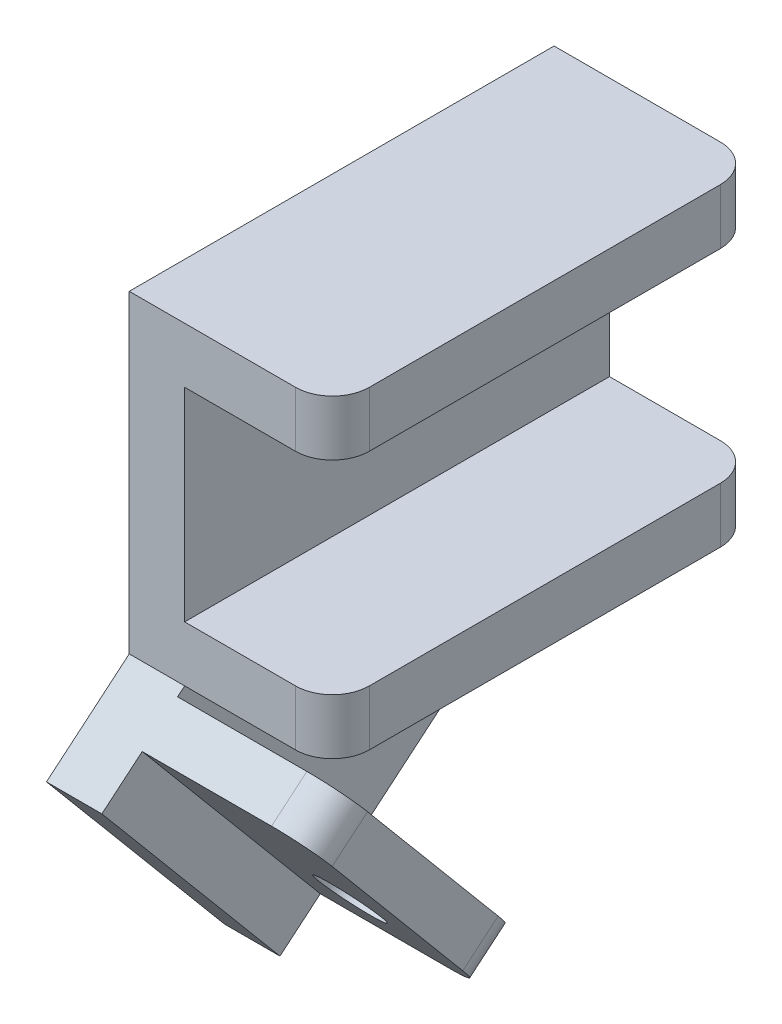
ISO-10303-21;
HEADER;
FILE_DESCRIPTION(('STEP AP214'),'2;1');
FILE_NAME('part.step','',(''),(''),'','','');
FILE_SCHEMA(('AUTOMOTIVE_DESIGN { 1 0 10303 214 1 1 1 1 }'));
ENDSEC;
DATA;
#1=APPLICATION_CONTEXT('core data for automotive mechanical design processes');
#2=APPLICATION_PROTOCOL_DEFINITION('international standard','automotive_design',2000,#1);
#3=PRODUCT_CONTEXT('',#1,'mechanical');
#4=PRODUCT('Part','Part','',(#3));
#5=PRODUCT_RELATED_PRODUCT_CATEGORY('part','',(#4));
#6=PRODUCT_DEFINITION_FORMATION('','',#4);
#7=PRODUCT_DEFINITION_CONTEXT('part definition',#1,'design');
#8=PRODUCT_DEFINITION('design','',#6,#7);
#9=PRODUCT_DEFINITION_SHAPE('','',#8);
#10=(LENGTH_UNIT() NAMED_UNIT(*) SI_UNIT(.MILLI.,.METRE.));
#11=(NAMED_UNIT(*) PLANE_ANGLE_UNIT() SI_UNIT($,.RADIAN.));
#12=(NAMED_UNIT(*) SI_UNIT($,.STERADIAN.) SOLID_ANGLE_UNIT());
#13=UNCERTAINTY_MEASURE_WITH_UNIT(LENGTH_MEASURE(1.E-05),#10,'distance_accuracy_value','');
#14=(GEOMETRIC_REPRESENTATION_CONTEXT(3) GLOBAL_UNCERTAINTY_ASSIGNED_CONTEXT((#13)) GLOBAL_UNIT_ASSIGNED_CONTEXT((#10,
#11,#12)) REPRESENTATION_CONTEXT('',''));
#15=CARTESIAN_POINT('',(0.,0.,0.));
#16=DIRECTION('',(0.,0.,1.));
#17=DIRECTION('',(1.,0.,0.));
#18=AXIS2_PLACEMENT_3D('',#15,#16,#17);
#19=CARTESIAN_POINT('',(-8.,-15.9283628290596,25.2981333293569));
#20=DIRECTION('',(0.,0.642787609686538,-0.76604444311898));
#21=DIRECTION('',(0.,0.76604444311898,0.642787609686538));
#22=AXIS2_PLACEMENT_3D('',#19,#20,#21);
#23=PLANE('',#22);
#24=CARTESIAN_POINT('',(-3.5,-23.9718294818089,18.5488634276483));
#25=DIRECTION('',(0.,0.642787609686538,-0.76604444311898));
#26=DIRECTION('',(0.,0.76604444311898,0.642787609686538));
#27=AXIS2_PLACEMENT_3D('',#24,#25,#26);
#28=CIRCLE('',#27,1.7);
#29=CARTESIAN_POINT('',(-3.5,-22.6695539285066,19.6416023641154));
#30=VERTEX_POINT('',#29);
#31=EDGE_CURVE('E226',#30,#30,#28,.T.);
#32=ORIENTED_EDGE('',*,*,#31,.T.);
#33=EDGE_LOOP('',(#32));
#34=FACE_BOUND('',#33,.T.);
#35=DIRECTION('',(0.,-0.766044443118979,-0.642787609686538));
#36=VECTOR('',#35,1.);
#37=CARTESIAN_POINT('',(0.999999999999999,-27.4190294758443,15.6563191840589));
#38=LINE('',#37,#36);
#39=CARTESIAN_POINT('',(0.999999999999999,-17.4604517152976,24.0125581099839));
#40=VERTEX_POINT('',#39);
#41=CARTESIAN_POINT('',(0.999999999999999,-25.8869405896063,16.9418944034319));
#42=VERTEX_POINT('',#41);
#43=EDGE_CURVE('E230',#40,#42,#38,.T.);
#44=ORIENTED_EDGE('',*,*,#43,.F.);
#45=CARTESIAN_POINT('',(-1.,-17.4604517152976,24.0125581099839));
#46=DIRECTION('',(0.,0.642787609686538,-0.76604444311898));
#47=DIRECTION('',(0.,0.76604444311898,0.642787609686538));
#48=AXIS2_PLACEMENT_3D('',#45,#46,#47);
#49=CIRCLE('',#48,2.);
#50=CARTESIAN_POINT('',(-1.,-15.9283628290596,25.2981333293569));
#51=VERTEX_POINT('',#50);
#52=EDGE_CURVE('E277',#40,#51,#49,.F.);
#53=ORIENTED_EDGE('',*,*,#52,.T.);
#54=DIRECTION('',(-1.,0.,0.));
#55=VECTOR('',#54,1.);
#56=CARTESIAN_POINT('',(-8.,-15.9283628290596,25.2981333293569));
#57=LINE('',#56,#55);
#58=CARTESIAN_POINT('',(-8.,-15.9283628290596,25.2981333293569));
#59=VERTEX_POINT('',#58);
#60=EDGE_CURVE('E398',#51,#59,#57,.T.);
#61=ORIENTED_EDGE('',*,*,#60,.T.);
#62=DIRECTION('',(0.,0.766044443118979,0.642787609686538));
#63=VECTOR('',#62,1.);
#64=CARTESIAN_POINT('',(-8.,-15.9283628290596,25.2981333293569));
#65=LINE('',#64,#63);
#66=CARTESIAN_POINT('',(-8.,-27.4190294758443,15.6563191840589));
#67=VERTEX_POINT('',#66);
#68=EDGE_CURVE('E209',#67,#59,#65,.T.);
#69=ORIENTED_EDGE('',*,*,#68,.F.);
#70=DIRECTION('',(-1.,0.,0.));
#71=VECTOR('',#70,1.);
#72=CARTESIAN_POINT('',(-8.,-27.4190294758443,15.6563191840589));
#73=LINE('',#72,#71);
#74=CARTESIAN_POINT('',(-1.,-27.4190294758443,15.6563191840589));
#75=VERTEX_POINT('',#74);
#76=EDGE_CURVE('E401',#75,#67,#73,.T.);
#77=ORIENTED_EDGE('',*,*,#76,.F.);
#78=CARTESIAN_POINT('',(-1.,-25.8869405896063,16.9418944034319));
#79=DIRECTION('',(0.,0.642787609686538,-0.76604444311898));
#80=DIRECTION('',(0.,0.76604444311898,0.642787609686538));
#81=AXIS2_PLACEMENT_3D('',#78,#79,#80);
#82=CIRCLE('',#81,2.);
#83=EDGE_CURVE('E275',#75,#42,#82,.F.);
#84=ORIENTED_EDGE('',*,*,#83,.T.);
#85=EDGE_LOOP('',(#44,#53,#61,#69,#77,#84));
#86=FACE_BOUND('',#85,.T.);
#87=ADVANCED_FACE('F33',(#34,#86),#23,.F.);
#88=CARTESIAN_POINT('',(-8.,0.,0.));
#89=DIRECTION('',(-1.,0.,0.));
#90=DIRECTION('',(0.,0.,1.));
#91=AXIS2_PLACEMENT_3D('',#88,#89,#90);
#92=PLANE('',#91);
#93=DIRECTION('',(0.,0.76604444311898,0.642787609686537));
#94=VECTOR('',#93,1.);
#95=CARTESIAN_POINT('',(-8.,-14.3213938048433,23.3830222215595));
#96=LINE('',#95,#94);
#97=CARTESIAN_POINT('',(-8.,-25.812060451628,13.7412080762614));
#98=VERTEX_POINT('',#97);
#99=CARTESIAN_POINT('',(-8.,-14.3213938048433,23.3830222215595));
#100=VERTEX_POINT('',#99);
#101=EDGE_CURVE('E229',#98,#100,#96,.T.);
#102=ORIENTED_EDGE('',*,*,#101,.F.);
#103=DIRECTION('',(0.,-0.642787609686538,0.766044443118979));
#104=VECTOR('',#103,1.);
#105=CARTESIAN_POINT('',(-8.,-14.1653774871443,-0.13876818846781));
#106=LINE('',#105,#104);
#107=CARTESIAN_POINT('',(-8.,-14.1653774871443,-0.13876818846781));
#108=VERTEX_POINT('',#107);
#109=EDGE_CURVE('E242',#108,#98,#106,.T.);
#110=ORIENTED_EDGE('',*,*,#109,.F.);
#111=DIRECTION('',(0.,-0.766044443118982,-0.642787609686535));
#112=VECTOR('',#111,1.);
#113=CARTESIAN_POINT('',(-8.,-14.,0.));
#114=LINE('',#113,#112);
#115=CARTESIAN_POINT('',(-8.,-14.,0.));
#116=VERTEX_POINT('',#115);
#117=EDGE_CURVE('E246',#116,#108,#114,.T.);
#118=ORIENTED_EDGE('',*,*,#117,.F.);
#119=DIRECTION('',(0.,0.,-1.));
#120=VECTOR('',#119,1.);
#121=CARTESIAN_POINT('',(-8.,-14.,23.));
#122=LINE('',#121,#120);
#123=CARTESIAN_POINT('',(-8.,-14.,23.));
#124=VERTEX_POINT('',#123);
#125=EDGE_CURVE('E250',#124,#116,#122,.T.);
#126=ORIENTED_EDGE('',*,*,#125,.F.);
#127=DIRECTION('',(0.,-0.642787609686537,0.76604444311898));
#128=VECTOR('',#127,1.);
#129=CARTESIAN_POINT('',(-8.,-14.,23.));
#130=LINE('',#129,#128);
#131=EDGE_CURVE('E245',#124,#100,#130,.T.);
#132=ORIENTED_EDGE('',*,*,#131,.T.);
#133=EDGE_LOOP('',(#102,#110,#118,#126,#132));
#134=FACE_BOUND('',#133,.T.);
#135=ADVANCED_FACE('F428',(#134),#92,.F.);
#136=CARTESIAN_POINT('',(0.,0.,23.));
#137=DIRECTION('',(-1.,0.,0.));
#138=DIRECTION('',(0.,0.,1.));
#139=AXIS2_PLACEMENT_3D('',#136,#137,#138);
#140=PLANE('',#139);
#141=DIRECTION('',(0.,0.,-1.));
#142=VECTOR('',#141,1.);
#143=CARTESIAN_POINT('',(0.,0.,23.));
#144=LINE('',#143,#142);
#145=CARTESIAN_POINT('',(0.,0.,21.));
#146=VERTEX_POINT('',#145);
#147=CARTESIAN_POINT('',(0.,0.,2.));
#148=VERTEX_POINT('',#147);
#149=EDGE_CURVE('E376',#146,#148,#144,.T.);
#150=ORIENTED_EDGE('',*,*,#149,.T.);
#151=DIRECTION('',(0.,1.,0.));
#152=VECTOR('',#151,1.);
#153=CARTESIAN_POINT('',(0.,0.,2.));
#154=LINE('',#153,#152);
#155=CARTESIAN_POINT('',(0.,3.,2.));
#156=VERTEX_POINT('',#155);
#157=EDGE_CURVE('E307',#148,#156,#154,.T.);
#158=ORIENTED_EDGE('',*,*,#157,.T.);
#159=DIRECTION('',(0.,0.,-1.));
#160=VECTOR('',#159,1.);
#161=CARTESIAN_POINT('',(0.,3.,23.));
#162=LINE('',#161,#160);
#163=CARTESIAN_POINT('',(0.,3.,21.));
#164=VERTEX_POINT('',#163);
#165=EDGE_CURVE('E272',#164,#156,#162,.T.);
#166=ORIENTED_EDGE('',*,*,#165,.F.);
#167=DIRECTION('',(0.,1.,0.));
#168=VECTOR('',#167,1.);
#169=CARTESIAN_POINT('',(0.,0.,21.));
#170=LINE('',#169,#168);
#171=EDGE_CURVE('E305',#164,#146,#170,.F.);
#172=ORIENTED_EDGE('',*,*,#171,.T.);
#173=EDGE_LOOP('',(#150,#158,#166,#172));
#174=FACE_BOUND('',#173,.T.);
#175=ADVANCED_FACE('F469',(#174),#140,.F.);
#176=CARTESIAN_POINT('',(0.,3.,23.));
#177=DIRECTION('',(0.,-1.,0.));
#178=DIRECTION('',(0.,0.,-1.));
#179=AXIS2_PLACEMENT_3D('',#176,#177,#178);
#180=PLANE('',#179);
#181=ORIENTED_EDGE('',*,*,#165,.T.);
#182=CARTESIAN_POINT('',(-2.,3.,2.));
#183=DIRECTION('',(0.,-1.,0.));
#184=DIRECTION('',(0.,0.,-1.));
#185=AXIS2_PLACEMENT_3D('',#182,#183,#184);
#186=CIRCLE('',#185,2.);
#187=CARTESIAN_POINT('',(-2.,3.,0.));
#188=VERTEX_POINT('',#187);
#189=EDGE_CURVE('E311',#156,#188,#186,.F.);
#190=ORIENTED_EDGE('',*,*,#189,.T.);
#191=DIRECTION('',(-1.,0.,0.));
#192=VECTOR('',#191,1.);
#193=CARTESIAN_POINT('',(0.,3.,0.));
#194=LINE('',#193,#192);
#195=CARTESIAN_POINT('',(-11.,3.,0.));
#196=VERTEX_POINT('',#195);
#197=EDGE_CURVE('E397',#188,#196,#194,.T.);
#198=ORIENTED_EDGE('',*,*,#197,.T.);
#199=DIRECTION('',(0.,0.,-1.));
#200=VECTOR('',#199,1.);
#201=CARTESIAN_POINT('',(-11.,3.,23.));
#202=LINE('',#201,#200);
#203=CARTESIAN_POINT('',(-11.,3.,23.));
#204=VERTEX_POINT('',#203);
#205=EDGE_CURVE('E348',#204,#196,#202,.T.);
#206=ORIENTED_EDGE('',*,*,#205,.F.);
#207=DIRECTION('',(-1.,0.,0.));
#208=VECTOR('',#207,1.);
#209=CARTESIAN_POINT('',(0.,3.,23.));
#210=LINE('',#209,#208);
#211=CARTESIAN_POINT('',(-2.,3.,23.));
#212=VERTEX_POINT('',#211);
#213=EDGE_CURVE('E375',#212,#204,#210,.T.);
#214=ORIENTED_EDGE('',*,*,#213,.F.);
#215=CARTESIAN_POINT('',(-2.,3.,21.));
#216=DIRECTION('',(0.,-1.,0.));
#217=DIRECTION('',(0.,0.,-1.));
#218=AXIS2_PLACEMENT_3D('',#215,#216,#217);
#219=CIRCLE('',#218,2.);
#220=EDGE_CURVE('E56',#212,#164,#219,.F.);
#221=ORIENTED_EDGE('',*,*,#220,.T.);
#222=EDGE_LOOP('',(#181,#190,#198,#206,#214,#221));
#223=FACE_BOUND('',#222,.T.);
#224=ADVANCED_FACE('F495',(#223),#180,.F.);
#225=CARTESIAN_POINT('',(-11.,3.,23.));
#226=DIRECTION('',(1.,0.,0.));
#227=DIRECTION('',(0.,0.,-1.));
#228=AXIS2_PLACEMENT_3D('',#225,#226,#227);
#229=PLANE('',#228);
#230=CARTESIAN_POINT('',(-11.,-5.,6.));
#231=DIRECTION('',(-1.,0.,0.));
#232=DIRECTION('',(0.,0.,1.));
#233=AXIS2_PLACEMENT_3D('',#230,#231,#232);
#234=CIRCLE('',#233,1.6);
#235=CARTESIAN_POINT('',(-11.,-5.,7.6));
#236=VERTEX_POINT('',#235);
#237=EDGE_CURVE('E215',#236,#236,#234,.T.);
#238=ORIENTED_EDGE('',*,*,#237,.F.);
#239=EDGE_LOOP('',(#238));
#240=FACE_BOUND('',#239,.T.);
#241=DIRECTION('',(0.,-1.,0.));
#242=VECTOR('',#241,1.);
#243=CARTESIAN_POINT('',(-11.,3.,0.));
#244=LINE('',#243,#242);
#245=CARTESIAN_POINT('',(-11.,-14.,0.));
#246=VERTEX_POINT('',#245);
#247=EDGE_CURVE('E361',#196,#246,#244,.T.);
#248=ORIENTED_EDGE('',*,*,#247,.T.);
#249=DIRECTION('',(0.,-0.766044443118982,-0.642787609686535));
#250=VECTOR('',#249,1.);
#251=CARTESIAN_POINT('',(-11.,-14.,0.));
#252=LINE('',#251,#250);
#253=CARTESIAN_POINT('',(-11.,-14.1653774871443,-0.13876818846781));
#254=VERTEX_POINT('',#253);
#255=EDGE_CURVE('E191',#246,#254,#252,.T.);
#256=ORIENTED_EDGE('',*,*,#255,.T.);
#257=DIRECTION('',(0.,-0.642787609686538,0.766044443118979));
#258=VECTOR('',#257,1.);
#259=CARTESIAN_POINT('',(-11.,-14.1653774871443,-0.13876818846781));
#260=LINE('',#259,#258);
#261=CARTESIAN_POINT('',(-11.,-29.2509741634509,17.839545846948));
#262=VERTEX_POINT('',#261);
#263=EDGE_CURVE('E184',#254,#262,#260,.T.);
#264=ORIENTED_EDGE('',*,*,#263,.T.);
#265=DIRECTION('',(0.,-0.766044443118979,-0.642787609686538));
#266=VECTOR('',#265,1.);
#267=CARTESIAN_POINT('',(-11.,-17.7603075166663,27.481359992246));
#268=LINE('',#267,#266);
#269=CARTESIAN_POINT('',(-11.,-17.7603075166663,27.481359992246));
#270=VERTEX_POINT('',#269);
#271=EDGE_CURVE('E190',#270,#262,#268,.T.);
#272=ORIENTED_EDGE('',*,*,#271,.F.);
#273=DIRECTION('',(0.,-0.642787609686537,0.76604444311898));
#274=VECTOR('',#273,1.);
#275=CARTESIAN_POINT('',(-11.,-14.,23.));
#276=LINE('',#275,#274);
#277=CARTESIAN_POINT('',(-11.,-14.,23.));
#278=VERTEX_POINT('',#277);
#279=EDGE_CURVE('E193',#278,#270,#276,.T.);
#280=ORIENTED_EDGE('',*,*,#279,.F.);
#281=DIRECTION('',(0.,-1.,0.));
#282=VECTOR('',#281,1.);
#283=CARTESIAN_POINT('',(-11.,3.,23.));
#284=LINE('',#283,#282);
#285=EDGE_CURVE('E411',#204,#278,#284,.T.);
#286=ORIENTED_EDGE('',*,*,#285,.F.);
#287=ORIENTED_EDGE('',*,*,#205,.T.);
#288=EDGE_LOOP('',(#248,#256,#264,#272,#280,#286,#287));
#289=FACE_BOUND('',#288,.T.);
#290=ADVANCED_FACE('F187',(#240,#289),#229,.F.);
#291=CARTESIAN_POINT('',(-11.,-14.,23.));
#292=DIRECTION('',(0.,1.,0.));
#293=DIRECTION('',(0.,0.,1.));
#294=AXIS2_PLACEMENT_3D('',#291,#292,#293);
#295=PLANE('',#294);
#296=DIRECTION('',(1.,0.,0.));
#297=VECTOR('',#296,1.);
#298=CARTESIAN_POINT('',(-11.,-14.,0.));
#299=LINE('',#298,#297);
#300=CARTESIAN_POINT('',(-2.,-14.,0.));
#301=VERTEX_POINT('',#300);
#302=EDGE_CURVE('E357',#116,#301,#299,.T.);
#303=ORIENTED_EDGE('',*,*,#302,.T.);
#304=CARTESIAN_POINT('',(-2.,-14.,2.));
#305=DIRECTION('',(0.,1.,0.));
#306=DIRECTION('',(0.,0.,1.));
#307=AXIS2_PLACEMENT_3D('',#304,#305,#306);
#308=CIRCLE('',#307,2.);
#309=CARTESIAN_POINT('',(0.,-14.,2.));
#310=VERTEX_POINT('',#309);
#311=EDGE_CURVE('E294',#301,#310,#308,.F.);
#312=ORIENTED_EDGE('',*,*,#311,.T.);
#313=DIRECTION('',(0.,0.,-1.));
#314=VECTOR('',#313,1.);
#315=CARTESIAN_POINT('',(0.,-14.,23.));
#316=LINE('',#315,#314);
#317=CARTESIAN_POINT('',(0.,-14.,21.));
#318=VERTEX_POINT('',#317);
#319=EDGE_CURVE('E342',#318,#310,#316,.T.);
#320=ORIENTED_EDGE('',*,*,#319,.F.);
#321=CARTESIAN_POINT('',(-2.,-14.,21.));
#322=DIRECTION('',(0.,1.,0.));
#323=DIRECTION('',(0.,0.,1.));
#324=AXIS2_PLACEMENT_3D('',#321,#322,#323);
#325=CIRCLE('',#324,2.);
#326=CARTESIAN_POINT('',(-2.,-14.,23.));
#327=VERTEX_POINT('',#326);
#328=EDGE_CURVE('E292',#318,#327,#325,.F.);
#329=ORIENTED_EDGE('',*,*,#328,.T.);
#330=DIRECTION('',(1.,0.,0.));
#331=VECTOR('',#330,1.);
#332=CARTESIAN_POINT('',(-11.,-14.,23.));
#333=LINE('',#332,#331);
#334=EDGE_CURVE('E326',#124,#327,#333,.T.);
#335=ORIENTED_EDGE('',*,*,#334,.F.);
#336=ORIENTED_EDGE('',*,*,#125,.T.);
#337=EDGE_LOOP('',(#303,#312,#320,#329,#335,#336));
#338=FACE_BOUND('',#337,.T.);
#339=ADVANCED_FACE('F347',(#338),#295,.F.);
#340=CARTESIAN_POINT('',(0.,-11.,23.));
#341=DIRECTION('',(1.,0.,0.));
#342=DIRECTION('',(0.,0.,-1.));
#343=AXIS2_PLACEMENT_3D('',#340,#341,#342);
#344=PLANE('',#343);
#345=ORIENTED_EDGE('',*,*,#319,.T.);
#346=DIRECTION('',(0.,-1.,0.));
#347=VECTOR('',#346,1.);
#348=CARTESIAN_POINT('',(0.,-11.,2.));
#349=LINE('',#348,#347);
#350=CARTESIAN_POINT('',(0.,-11.,2.));
#351=VERTEX_POINT('',#350);
#352=EDGE_CURVE('E299',#310,#351,#349,.F.);
#353=ORIENTED_EDGE('',*,*,#352,.T.);
#354=DIRECTION('',(0.,0.,-1.));
#355=VECTOR('',#354,1.);
#356=CARTESIAN_POINT('',(0.,-11.,23.));
#357=LINE('',#356,#355);
#358=CARTESIAN_POINT('',(0.,-11.,21.));
#359=VERTEX_POINT('',#358);
#360=EDGE_CURVE('E344',#359,#351,#357,.T.);
#361=ORIENTED_EDGE('',*,*,#360,.F.);
#362=DIRECTION('',(0.,-1.,0.));
#363=VECTOR('',#362,1.);
#364=CARTESIAN_POINT('',(0.,-11.,21.));
#365=LINE('',#364,#363);
#366=EDGE_CURVE('E296',#359,#318,#365,.T.);
#367=ORIENTED_EDGE('',*,*,#366,.T.);
#368=EDGE_LOOP('',(#345,#353,#361,#367));
#369=FACE_BOUND('',#368,.T.);
#370=ADVANCED_FACE('F341',(#369),#344,.T.);
#371=CARTESIAN_POINT('',(-8.,-11.,23.));
#372=DIRECTION('',(0.,1.,0.));
#373=DIRECTION('',(-1.,0.,0.));
#374=AXIS2_PLACEMENT_3D('',#371,#372,#373);
#375=PLANE('',#374);
#376=ORIENTED_EDGE('',*,*,#360,.T.);
#377=CARTESIAN_POINT('',(-2.,-11.,2.));
#378=DIRECTION('',(0.,1.,0.));
#379=DIRECTION('',(-1.,0.,0.));
#380=AXIS2_PLACEMENT_3D('',#377,#378,#379);
#381=CIRCLE('',#380,2.);
#382=CARTESIAN_POINT('',(-2.,-11.,0.));
#383=VERTEX_POINT('',#382);
#384=EDGE_CURVE('E303',#351,#383,#381,.T.);
#385=ORIENTED_EDGE('',*,*,#384,.T.);
#386=DIRECTION('',(1.,0.,0.));
#387=VECTOR('',#386,1.);
#388=CARTESIAN_POINT('',(-8.,-11.,0.));
#389=LINE('',#388,#387);
#390=CARTESIAN_POINT('',(-8.,-11.,0.));
#391=VERTEX_POINT('',#390);
#392=EDGE_CURVE('E366',#391,#383,#389,.T.);
#393=ORIENTED_EDGE('',*,*,#392,.F.);
#394=DIRECTION('',(0.,0.,-1.));
#395=VECTOR('',#394,1.);
#396=CARTESIAN_POINT('',(-8.,-11.,23.));
#397=LINE('',#396,#395);
#398=CARTESIAN_POINT('',(-8.,-11.,23.));
#399=VERTEX_POINT('',#398);
#400=EDGE_CURVE('E334',#399,#391,#397,.T.);
#401=ORIENTED_EDGE('',*,*,#400,.F.);
#402=DIRECTION('',(1.,0.,0.));
#403=VECTOR('',#402,1.);
#404=CARTESIAN_POINT('',(-8.,-11.,23.));
#405=LINE('',#404,#403);
#406=CARTESIAN_POINT('',(-2.,-11.,23.));
#407=VERTEX_POINT('',#406);
#408=EDGE_CURVE('E322',#399,#407,#405,.T.);
#409=ORIENTED_EDGE('',*,*,#408,.T.);
#410=CARTESIAN_POINT('',(-2.,-11.,21.));
#411=DIRECTION('',(0.,1.,0.));
#412=DIRECTION('',(-1.,0.,0.));
#413=AXIS2_PLACEMENT_3D('',#410,#411,#412);
#414=CIRCLE('',#413,2.);
#415=EDGE_CURVE('E301',#407,#359,#414,.T.);
#416=ORIENTED_EDGE('',*,*,#415,.T.);
#417=EDGE_LOOP('',(#376,#385,#393,#401,#409,#416));
#418=FACE_BOUND('',#417,.T.);
#419=ADVANCED_FACE('F331',(#418),#375,.T.);
#420=CARTESIAN_POINT('',(-8.,0.,23.));
#421=DIRECTION('',(1.,0.,0.));
#422=DIRECTION('',(0.,1.,0.));
#423=AXIS2_PLACEMENT_3D('',#420,#421,#422);
#424=PLANE('',#423);
#425=CARTESIAN_POINT('',(-8.,-5.,6.));
#426=DIRECTION('',(1.,0.,0.));
#427=DIRECTION('',(0.,1.,0.));
#428=AXIS2_PLACEMENT_3D('',#425,#426,#427);
#429=CIRCLE('',#428,1.6);
#430=CARTESIAN_POINT('',(-8.,-3.4,6.));
#431=VERTEX_POINT('',#430);
#432=EDGE_CURVE('E212',#431,#431,#429,.T.);
#433=ORIENTED_EDGE('',*,*,#432,.F.);
#434=EDGE_LOOP('',(#433));
#435=FACE_BOUND('',#434,.T.);
#436=DIRECTION('',(0.,-1.,0.));
#437=VECTOR('',#436,1.);
#438=CARTESIAN_POINT('',(-8.,0.,0.));
#439=LINE('',#438,#437);
#440=CARTESIAN_POINT('',(-8.,0.,0.));
#441=VERTEX_POINT('',#440);
#442=EDGE_CURVE('E370',#441,#391,#439,.T.);
#443=ORIENTED_EDGE('',*,*,#442,.F.);
#444=DIRECTION('',(0.,0.,-1.));
#445=VECTOR('',#444,1.);
#446=CARTESIAN_POINT('',(-8.,0.,23.));
#447=LINE('',#446,#445);
#448=CARTESIAN_POINT('',(-8.,0.,23.));
#449=VERTEX_POINT('',#448);
#450=EDGE_CURVE('E379',#449,#441,#447,.T.);
#451=ORIENTED_EDGE('',*,*,#450,.F.);
#452=DIRECTION('',(0.,-1.,0.));
#453=VECTOR('',#452,1.);
#454=CARTESIAN_POINT('',(-8.,0.,23.));
#455=LINE('',#454,#453);
#456=EDGE_CURVE('E335',#449,#399,#455,.T.);
#457=ORIENTED_EDGE('',*,*,#456,.T.);
#458=ORIENTED_EDGE('',*,*,#400,.T.);
#459=EDGE_LOOP('',(#443,#451,#457,#458));
#460=FACE_BOUND('',#459,.T.);
#461=ADVANCED_FACE('F384',(#435,#460),#424,.T.);
#462=CARTESIAN_POINT('',(0.,0.,23.));
#463=DIRECTION('',(0.,-1.,0.));
#464=DIRECTION('',(0.,0.,-1.));
#465=AXIS2_PLACEMENT_3D('',#462,#463,#464);
#466=PLANE('',#465);
#467=DIRECTION('',(-1.,0.,0.));
#468=VECTOR('',#467,1.);
#469=CARTESIAN_POINT('',(0.,0.,0.));
#470=LINE('',#469,#468);
#471=CARTESIAN_POINT('',(-2.,0.,0.));
#472=VERTEX_POINT('',#471);
#473=EDGE_CURVE('E373',#472,#441,#470,.T.);
#474=ORIENTED_EDGE('',*,*,#473,.F.);
#475=CARTESIAN_POINT('',(-2.,0.,2.));
#476=DIRECTION('',(0.,-1.,0.));
#477=DIRECTION('',(0.,0.,-1.));
#478=AXIS2_PLACEMENT_3D('',#475,#476,#477);
#479=CIRCLE('',#478,2.);
#480=EDGE_CURVE('E314',#472,#148,#479,.T.);
#481=ORIENTED_EDGE('',*,*,#480,.T.);
#482=ORIENTED_EDGE('',*,*,#149,.F.);
#483=CARTESIAN_POINT('',(-2.,0.,21.));
#484=DIRECTION('',(0.,-1.,0.));
#485=DIRECTION('',(0.,0.,-1.));
#486=AXIS2_PLACEMENT_3D('',#483,#484,#485);
#487=CIRCLE('',#486,2.);
#488=CARTESIAN_POINT('',(-2.,0.,23.));
#489=VERTEX_POINT('',#488);
#490=EDGE_CURVE('E48',#146,#489,#487,.T.);
#491=ORIENTED_EDGE('',*,*,#490,.T.);
#492=DIRECTION('',(-1.,0.,0.));
#493=VECTOR('',#492,1.);
#494=CARTESIAN_POINT('',(0.,0.,23.));
#495=LINE('',#494,#493);
#496=EDGE_CURVE('E380',#489,#449,#495,.T.);
#497=ORIENTED_EDGE('',*,*,#496,.T.);
#498=ORIENTED_EDGE('',*,*,#450,.T.);
#499=EDGE_LOOP('',(#474,#481,#482,#491,#497,#498));
#500=FACE_BOUND('',#499,.T.);
#501=ADVANCED_FACE('F394',(#500),#466,.T.);
#502=CARTESIAN_POINT('',(0.,0.,23.));
#503=DIRECTION('',(0.,0.,1.));
#504=DIRECTION('',(1.,0.,0.));
#505=AXIS2_PLACEMENT_3D('',#502,#503,#504);
#506=PLANE('',#505);
#507=ORIENTED_EDGE('',*,*,#496,.F.);
#508=DIRECTION('',(0.,1.,0.));
#509=VECTOR('',#508,1.);
#510=CARTESIAN_POINT('',(-2.,3.,23.));
#511=LINE('',#510,#509);
#512=EDGE_CURVE('E11',#489,#212,#511,.T.);
#513=ORIENTED_EDGE('',*,*,#512,.T.);
#514=ORIENTED_EDGE('',*,*,#213,.T.);
#515=ORIENTED_EDGE('',*,*,#285,.T.);
#516=EDGE_CURVE('E255',#278,#124,#333,.T.);
#517=ORIENTED_EDGE('',*,*,#516,.T.);
#518=ORIENTED_EDGE('',*,*,#334,.T.);
#519=DIRECTION('',(0.,-1.,0.));
#520=VECTOR('',#519,1.);
#521=CARTESIAN_POINT('',(-2.,0.,23.));
#522=LINE('',#521,#520);
#523=EDGE_CURVE('E41',#327,#407,#522,.F.);
#524=ORIENTED_EDGE('',*,*,#523,.T.);
#525=ORIENTED_EDGE('',*,*,#408,.F.);
#526=ORIENTED_EDGE('',*,*,#456,.F.);
#527=EDGE_LOOP('',(#507,#513,#514,#515,#517,#518,#524,#525,#526));
#528=FACE_BOUND('',#527,.T.);
#529=ADVANCED_FACE('F320',(#528),#506,.T.);
#530=CARTESIAN_POINT('',(0.,0.,0.));
#531=DIRECTION('',(0.,0.,1.));
#532=DIRECTION('',(1.,0.,0.));
#533=AXIS2_PLACEMENT_3D('',#530,#531,#532);
#534=PLANE('',#533);
#535=ORIENTED_EDGE('',*,*,#392,.T.);
#536=DIRECTION('',(0.,-1.,0.));
#537=VECTOR('',#536,1.);
#538=CARTESIAN_POINT('',(-2.,-14.,0.));
#539=LINE('',#538,#537);
#540=EDGE_CURVE('E289',#383,#301,#539,.T.);
#541=ORIENTED_EDGE('',*,*,#540,.T.);
#542=ORIENTED_EDGE('',*,*,#302,.F.);
#543=EDGE_CURVE('E360',#246,#116,#299,.T.);
#544=ORIENTED_EDGE('',*,*,#543,.F.);
#545=ORIENTED_EDGE('',*,*,#247,.F.);
#546=ORIENTED_EDGE('',*,*,#197,.F.);
#547=DIRECTION('',(0.,1.,0.));
#548=VECTOR('',#547,1.);
#549=CARTESIAN_POINT('',(-2.,0.,0.));
#550=LINE('',#549,#548);
#551=EDGE_CURVE('E287',#188,#472,#550,.F.);
#552=ORIENTED_EDGE('',*,*,#551,.T.);
#553=ORIENTED_EDGE('',*,*,#473,.T.);
#554=ORIENTED_EDGE('',*,*,#442,.T.);
#555=EDGE_LOOP('',(#535,#541,#542,#544,#545,#546,#552,#553,#554));
#556=FACE_BOUND('',#555,.T.);
#557=ADVANCED_FACE('F389',(#556),#534,.F.);
#558=CARTESIAN_POINT('',(-8.,-14.,0.));
#559=DIRECTION('',(0.,0.642787609686535,-0.766044443118981));
#560=DIRECTION('',(0.,0.766044443118982,0.642787609686535));
#561=AXIS2_PLACEMENT_3D('',#558,#559,#560);
#562=PLANE('',#561);
#563=ORIENTED_EDGE('',*,*,#255,.F.);
#564=ORIENTED_EDGE('',*,*,#543,.T.);
#565=ORIENTED_EDGE('',*,*,#117,.T.);
#566=DIRECTION('',(-1.,0.,0.));
#567=VECTOR('',#566,1.);
#568=CARTESIAN_POINT('',(-8.,-14.1653774871443,-0.13876818846781));
#569=LINE('',#568,#567);
#570=EDGE_CURVE('E254',#108,#254,#569,.T.);
#571=ORIENTED_EDGE('',*,*,#570,.T.);
#572=EDGE_LOOP('',(#563,#564,#565,#571));
#573=FACE_BOUND('',#572,.T.);
#574=ADVANCED_FACE('F425',(#573),#562,.T.);
#575=CARTESIAN_POINT('',(-8.,-14.,23.));
#576=DIRECTION('',(0.,-0.76604444311898,-0.642787609686537));
#577=DIRECTION('',(0.,0.642787609686537,-0.76604444311898));
#578=AXIS2_PLACEMENT_3D('',#575,#576,#577);
#579=PLANE('',#578);
#580=ORIENTED_EDGE('',*,*,#60,.F.);
#581=DIRECTION('',(0.,-0.642787609686537,0.76604444311898));
#582=VECTOR('',#581,1.);
#583=CARTESIAN_POINT('',(-1.,-14.,23.));
#584=LINE('',#583,#582);
#585=CARTESIAN_POINT('',(-1.,-14.3213938048433,23.3830222215595));
#586=VERTEX_POINT('',#585);
#587=EDGE_CURVE('E279',#51,#586,#584,.F.);
#588=ORIENTED_EDGE('',*,*,#587,.T.);
#589=DIRECTION('',(-1.,0.,0.));
#590=VECTOR('',#589,1.);
#591=CARTESIAN_POINT('',(0.999999999999999,-14.3213938048433,23.3830222215595));
#592=LINE('',#591,#590);
#593=EDGE_CURVE('E236',#586,#100,#592,.T.);
#594=ORIENTED_EDGE('',*,*,#593,.T.);
#595=ORIENTED_EDGE('',*,*,#131,.F.);
#596=ORIENTED_EDGE('',*,*,#516,.F.);
#597=ORIENTED_EDGE('',*,*,#279,.T.);
#598=DIRECTION('',(-1.,0.,0.));
#599=VECTOR('',#598,1.);
#600=CARTESIAN_POINT('',(-11.,-17.7603075166663,27.481359992246));
#601=LINE('',#600,#599);
#602=CARTESIAN_POINT('',(-8.,-17.7603075166663,27.481359992246));
#603=VERTEX_POINT('',#602);
#604=EDGE_CURVE('E208',#603,#270,#601,.T.);
#605=ORIENTED_EDGE('',*,*,#604,.F.);
#606=DIRECTION('',(0.,0.642787609686538,-0.766044443118979));
#607=VECTOR('',#606,1.);
#608=CARTESIAN_POINT('',(-8.,-17.7603075166663,27.481359992246));
#609=LINE('',#608,#607);
#610=EDGE_CURVE('E218',#603,#59,#609,.T.);
#611=ORIENTED_EDGE('',*,*,#610,.T.);
#612=EDGE_LOOP('',(#580,#588,#594,#595,#596,#597,#605,#611));
#613=FACE_BOUND('',#612,.T.);
#614=ADVANCED_FACE('F417',(#613),#579,.F.);
#615=CARTESIAN_POINT('',(-8.,-14.1653774871443,-0.13876818846781));
#616=DIRECTION('',(0.,-0.766044443118979,-0.642787609686538));
#617=DIRECTION('',(0.,0.642787609686538,-0.766044443118979));
#618=AXIS2_PLACEMENT_3D('',#615,#616,#617);
#619=PLANE('',#618);
#620=DIRECTION('',(-1.,0.,0.));
#621=VECTOR('',#620,1.);
#622=CARTESIAN_POINT('',(0.999999999999999,-25.812060451628,13.7412080762614));
#623=LINE('',#622,#621);
#624=CARTESIAN_POINT('',(-1.,-25.812060451628,13.7412080762614));
#625=VERTEX_POINT('',#624);
#626=EDGE_CURVE('E240',#625,#98,#623,.T.);
#627=ORIENTED_EDGE('',*,*,#626,.F.);
#628=DIRECTION('',(0.,0.642787609686538,-0.766044443118979));
#629=VECTOR('',#628,1.);
#630=CARTESIAN_POINT('',(-1.,-27.4190294758443,15.6563191840589));
#631=LINE('',#630,#629);
#632=EDGE_CURVE('E285',#625,#75,#631,.F.);
#633=ORIENTED_EDGE('',*,*,#632,.T.);
#634=ORIENTED_EDGE('',*,*,#76,.T.);
#635=DIRECTION('',(0.,0.642787609686538,-0.766044443118979));
#636=VECTOR('',#635,1.);
#637=CARTESIAN_POINT('',(-8.,-29.2509741634509,17.839545846948));
#638=LINE('',#637,#636);
#639=CARTESIAN_POINT('',(-8.,-29.2509741634509,17.839545846948));
#640=VERTEX_POINT('',#639);
#641=EDGE_CURVE('E200',#640,#67,#638,.T.);
#642=ORIENTED_EDGE('',*,*,#641,.F.);
#643=DIRECTION('',(1.,0.,0.));
#644=VECTOR('',#643,1.);
#645=CARTESIAN_POINT('',(-11.,-29.2509741634509,17.839545846948));
#646=LINE('',#645,#644);
#647=EDGE_CURVE('E196',#262,#640,#646,.T.);
#648=ORIENTED_EDGE('',*,*,#647,.F.);
#649=ORIENTED_EDGE('',*,*,#263,.F.);
#650=ORIENTED_EDGE('',*,*,#570,.F.);
#651=ORIENTED_EDGE('',*,*,#109,.T.);
#652=EDGE_LOOP('',(#627,#633,#634,#642,#648,#649,#650,#651));
#653=FACE_BOUND('',#652,.T.);
#654=ADVANCED_FACE('F198',(#653),#619,.T.);
#655=CARTESIAN_POINT('',(0.999999999999999,-14.3213938048433,23.3830222215595));
#656=DIRECTION('',(0.,-0.642787609686537,0.76604444311898));
#657=DIRECTION('',(0.,-0.76604444311898,-0.642787609686537));
#658=AXIS2_PLACEMENT_3D('',#655,#656,#657);
#659=PLANE('',#658);
#660=CARTESIAN_POINT('',(-3.5,-22.3648604575926,16.6337523198509));
#661=DIRECTION('',(0.,0.642787609686538,-0.766044443118979));
#662=DIRECTION('',(0.,0.766044443118979,0.642787609686538));
#663=AXIS2_PLACEMENT_3D('',#660,#661,#662);
#664=CIRCLE('',#663,1.7);
#665=CARTESIAN_POINT('',(-3.5,-21.0625849042903,17.726491256318));
#666=VERTEX_POINT('',#665);
#667=EDGE_CURVE('E223',#666,#666,#664,.T.);
#668=ORIENTED_EDGE('',*,*,#667,.F.);
#669=EDGE_LOOP('',(#668));
#670=FACE_BOUND('',#669,.T.);
#671=ORIENTED_EDGE('',*,*,#593,.F.);
#672=CARTESIAN_POINT('',(-1.,-15.8534826910812,22.0974470021864));
#673=DIRECTION('',(0.,-0.642787609686537,0.76604444311898));
#674=DIRECTION('',(0.,-0.76604444311898,-0.642787609686537));
#675=AXIS2_PLACEMENT_3D('',#672,#673,#674);
#676=CIRCLE('',#675,2.);
#677=CARTESIAN_POINT('',(0.999999999999999,-15.8534826910812,22.0974470021864));
#678=VERTEX_POINT('',#677);
#679=EDGE_CURVE('E283',#586,#678,#676,.F.);
#680=ORIENTED_EDGE('',*,*,#679,.T.);
#681=DIRECTION('',(0.,0.76604444311898,0.642787609686537));
#682=VECTOR('',#681,1.);
#683=CARTESIAN_POINT('',(0.999999999999999,-14.3213938048433,23.3830222215595));
#684=LINE('',#683,#682);
#685=CARTESIAN_POINT('',(0.999999999999999,-24.27997156539,15.0267832956345));
#686=VERTEX_POINT('',#685);
#687=EDGE_CURVE('E233',#686,#678,#684,.T.);
#688=ORIENTED_EDGE('',*,*,#687,.F.);
#689=CARTESIAN_POINT('',(-1.,-24.27997156539,15.0267832956345));
#690=DIRECTION('',(0.,-0.642787609686537,0.76604444311898));
#691=DIRECTION('',(0.,-0.76604444311898,-0.642787609686537));
#692=AXIS2_PLACEMENT_3D('',#689,#690,#691);
#693=CIRCLE('',#692,2.);
#694=EDGE_CURVE('E281',#686,#625,#693,.F.);
#695=ORIENTED_EDGE('',*,*,#694,.T.);
#696=ORIENTED_EDGE('',*,*,#626,.T.);
#697=ORIENTED_EDGE('',*,*,#101,.T.);
#698=EDGE_LOOP('',(#671,#680,#688,#695,#696,#697));
#699=FACE_BOUND('',#698,.T.);
#700=ADVANCED_FACE('F475',(#670,#699),#659,.F.);
#701=CARTESIAN_POINT('',(0.999999999999999,0.,0.));
#702=DIRECTION('',(-1.,0.,0.));
#703=DIRECTION('',(0.,0.,1.));
#704=AXIS2_PLACEMENT_3D('',#701,#702,#703);
#705=PLANE('',#704);
#706=ORIENTED_EDGE('',*,*,#687,.T.);
#707=DIRECTION('',(0.,-0.642787609686537,0.76604444311898));
#708=VECTOR('',#707,1.);
#709=CARTESIAN_POINT('',(0.999999999999999,1.57766302973388,1.32381646637172));
#710=LINE('',#709,#708);
#711=EDGE_CURVE('E271',#678,#40,#710,.T.);
#712=ORIENTED_EDGE('',*,*,#711,.T.);
#713=ORIENTED_EDGE('',*,*,#43,.T.);
#714=DIRECTION('',(0.,0.642787609686538,-0.766044443118979));
#715=VECTOR('',#714,1.);
#716=CARTESIAN_POINT('',(0.999999999999999,-24.27997156539,15.0267832956345));
#717=LINE('',#716,#715);
#718=EDGE_CURVE('E268',#42,#686,#717,.T.);
#719=ORIENTED_EDGE('',*,*,#718,.T.);
#720=EDGE_LOOP('',(#706,#712,#713,#719));
#721=FACE_BOUND('',#720,.T.);
#722=ADVANCED_FACE('F439',(#721),#705,.F.);
#723=CARTESIAN_POINT('',(-3.5,-28.7194961435051,24.2069122281645));
#724=DIRECTION('',(0.,0.642787609686538,-0.766044443118979));
#725=DIRECTION('',(0.,0.76604444311898,0.642787609686538));
#726=AXIS2_PLACEMENT_3D('',#723,#724,#725);
#727=CYLINDRICAL_SURFACE('',#726,1.7);
#728=ORIENTED_EDGE('',*,*,#667,.T.);
#729=EDGE_LOOP('',(#728));
#730=FACE_BOUND('',#729,.T.);
#731=ORIENTED_EDGE('',*,*,#31,.F.);
#732=EDGE_LOOP('',(#731));
#733=FACE_BOUND('',#732,.T.);
#734=ADVANCED_FACE('F451',(#730,#733),#727,.F.);
#735=CARTESIAN_POINT('',(-8.,-17.7603075166663,27.481359992246));
#736=DIRECTION('',(-1.,0.,0.));
#737=DIRECTION('',(0.,-1.,0.));
#738=AXIS2_PLACEMENT_3D('',#735,#736,#737);
#739=PLANE('',#738);
#740=ORIENTED_EDGE('',*,*,#68,.T.);
#741=ORIENTED_EDGE('',*,*,#610,.F.);
#742=DIRECTION('',(0.,0.766044443118979,0.642787609686538));
#743=VECTOR('',#742,1.);
#744=CARTESIAN_POINT('',(-8.,-17.7603075166663,27.481359992246));
#745=LINE('',#744,#743);
#746=EDGE_CURVE('E203',#640,#603,#745,.T.);
#747=ORIENTED_EDGE('',*,*,#746,.F.);
#748=ORIENTED_EDGE('',*,*,#641,.T.);
#749=EDGE_LOOP('',(#740,#741,#747,#748));
#750=FACE_BOUND('',#749,.T.);
#751=ADVANCED_FACE('F449',(#750),#739,.F.);
#752=CARTESIAN_POINT('',(0.,-20.8700594326381,24.8719683065012));
#753=DIRECTION('',(0.,-0.642787609686538,0.766044443118979));
#754=DIRECTION('',(0.,-0.766044443118979,-0.642787609686538));
#755=AXIS2_PLACEMENT_3D('',#752,#753,#754);
#756=PLANE('',#755);
#757=ORIENTED_EDGE('',*,*,#271,.T.);
#758=ORIENTED_EDGE('',*,*,#647,.T.);
#759=ORIENTED_EDGE('',*,*,#746,.T.);
#760=ORIENTED_EDGE('',*,*,#604,.T.);
#761=EDGE_LOOP('',(#757,#758,#759,#760));
#762=FACE_BOUND('',#761,.T.);
#763=ADVANCED_FACE('F206',(#762),#756,.T.);
#764=CARTESIAN_POINT('',(0.999999999999999,-5.,6.));
#765=DIRECTION('',(-1.,0.,0.));
#766=DIRECTION('',(0.,0.,1.));
#767=AXIS2_PLACEMENT_3D('',#764,#765,#766);
#768=CYLINDRICAL_SURFACE('',#767,1.6);
#769=ORIENTED_EDGE('',*,*,#432,.T.);
#770=EDGE_LOOP('',(#769));
#771=FACE_BOUND('',#770,.T.);
#772=ORIENTED_EDGE('',*,*,#237,.T.);
#773=EDGE_LOOP('',(#772));
#774=FACE_BOUND('',#773,.T.);
#775=ADVANCED_FACE('F457',(#771,#774),#768,.F.);
#776=CARTESIAN_POINT('',(-1.,1.57766302973388,1.32381646637172));
#777=DIRECTION('',(0.,-0.642787609686537,0.76604444311898));
#778=DIRECTION('',(0.,-0.76604444311898,-0.642787609686537));
#779=AXIS2_PLACEMENT_3D('',#776,#777,#778);
#780=CYLINDRICAL_SURFACE('',#779,2.);
#781=ORIENTED_EDGE('',*,*,#679,.F.);
#782=ORIENTED_EDGE('',*,*,#587,.F.);
#783=ORIENTED_EDGE('',*,*,#52,.F.);
#784=ORIENTED_EDGE('',*,*,#711,.F.);
#785=EDGE_LOOP('',(#781,#782,#783,#784));
#786=FACE_BOUND('',#785,.T.);
#787=ADVANCED_FACE('F444',(#786),#780,.T.);
#788=CARTESIAN_POINT('',(-1.,-6.84882584457489,-5.74684724018019));
#789=DIRECTION('',(0.,-0.642787609686538,0.766044443118979));
#790=DIRECTION('',(0.,-0.766044443118979,-0.642787609686538));
#791=AXIS2_PLACEMENT_3D('',#788,#789,#790);
#792=CYLINDRICAL_SURFACE('',#791,2.);
#793=ORIENTED_EDGE('',*,*,#83,.F.);
#794=ORIENTED_EDGE('',*,*,#632,.F.);
#795=ORIENTED_EDGE('',*,*,#694,.F.);
#796=ORIENTED_EDGE('',*,*,#718,.F.);
#797=EDGE_LOOP('',(#793,#794,#795,#796));
#798=FACE_BOUND('',#797,.T.);
#799=ADVANCED_FACE('F435',(#798),#792,.T.);
#800=CARTESIAN_POINT('',(-2.,0.,2.));
#801=DIRECTION('',(0.,1.,0.));
#802=DIRECTION('',(0.,0.,1.));
#803=AXIS2_PLACEMENT_3D('',#800,#801,#802);
#804=CYLINDRICAL_SURFACE('',#803,2.);
#805=ORIENTED_EDGE('',*,*,#384,.F.);
#806=ORIENTED_EDGE('',*,*,#352,.F.);
#807=ORIENTED_EDGE('',*,*,#311,.F.);
#808=ORIENTED_EDGE('',*,*,#540,.F.);
#809=EDGE_LOOP('',(#805,#806,#807,#808));
#810=FACE_BOUND('',#809,.T.);
#811=ADVANCED_FACE('F505',(#810),#804,.T.);
#812=CARTESIAN_POINT('',(-2.,0.,2.));
#813=DIRECTION('',(0.,1.,0.));
#814=DIRECTION('',(0.,0.,1.));
#815=AXIS2_PLACEMENT_3D('',#812,#813,#814);
#816=CYLINDRICAL_SURFACE('',#815,2.);
#817=ORIENTED_EDGE('',*,*,#480,.F.);
#818=ORIENTED_EDGE('',*,*,#551,.F.);
#819=ORIENTED_EDGE('',*,*,#189,.F.);
#820=ORIENTED_EDGE('',*,*,#157,.F.);
#821=EDGE_LOOP('',(#817,#818,#819,#820));
#822=FACE_BOUND('',#821,.T.);
#823=ADVANCED_FACE('F508',(#822),#816,.T.);
#824=CARTESIAN_POINT('',(-2.,0.,21.));
#825=DIRECTION('',(0.,-1.,0.));
#826=DIRECTION('',(0.,0.,-1.));
#827=AXIS2_PLACEMENT_3D('',#824,#825,#826);
#828=CYLINDRICAL_SURFACE('',#827,2.);
#829=ORIENTED_EDGE('',*,*,#490,.F.);
#830=ORIENTED_EDGE('',*,*,#171,.F.);
#831=ORIENTED_EDGE('',*,*,#220,.F.);
#832=ORIENTED_EDGE('',*,*,#512,.F.);
#833=EDGE_LOOP('',(#829,#830,#831,#832));
#834=FACE_BOUND('',#833,.T.);
#835=ADVANCED_FACE('F511',(#834),#828,.T.);
#836=CARTESIAN_POINT('',(-2.,-11.,21.));
#837=DIRECTION('',(0.,-1.,0.));
#838=DIRECTION('',(0.,0.,-1.));
#839=AXIS2_PLACEMENT_3D('',#836,#837,#838);
#840=CYLINDRICAL_SURFACE('',#839,2.);
#841=ORIENTED_EDGE('',*,*,#415,.F.);
#842=ORIENTED_EDGE('',*,*,#523,.F.);
#843=ORIENTED_EDGE('',*,*,#328,.F.);
#844=ORIENTED_EDGE('',*,*,#366,.F.);
#845=EDGE_LOOP('',(#841,#842,#843,#844));
#846=FACE_BOUND('',#845,.T.);
#847=ADVANCED_FACE('F35',(#846),#840,.T.);
#848=CLOSED_SHELL('',(#87,#135,#175,#224,#290,#339,#370,#419,#461,#501,#529,#557,#574,#614,#654,
#700,#722,#734,#751,#763,#775,#787,#799,#811,#823,#835,#847));
#849=MANIFOLD_SOLID_BREP('B2',#848);
#850=ADVANCED_BREP_SHAPE_REPRESENTATION('',(#18,#849),#14);
#851=SHAPE_DEFINITION_REPRESENTATION(#9,#850);
ENDSEC;
END-ISO-10303-21;
